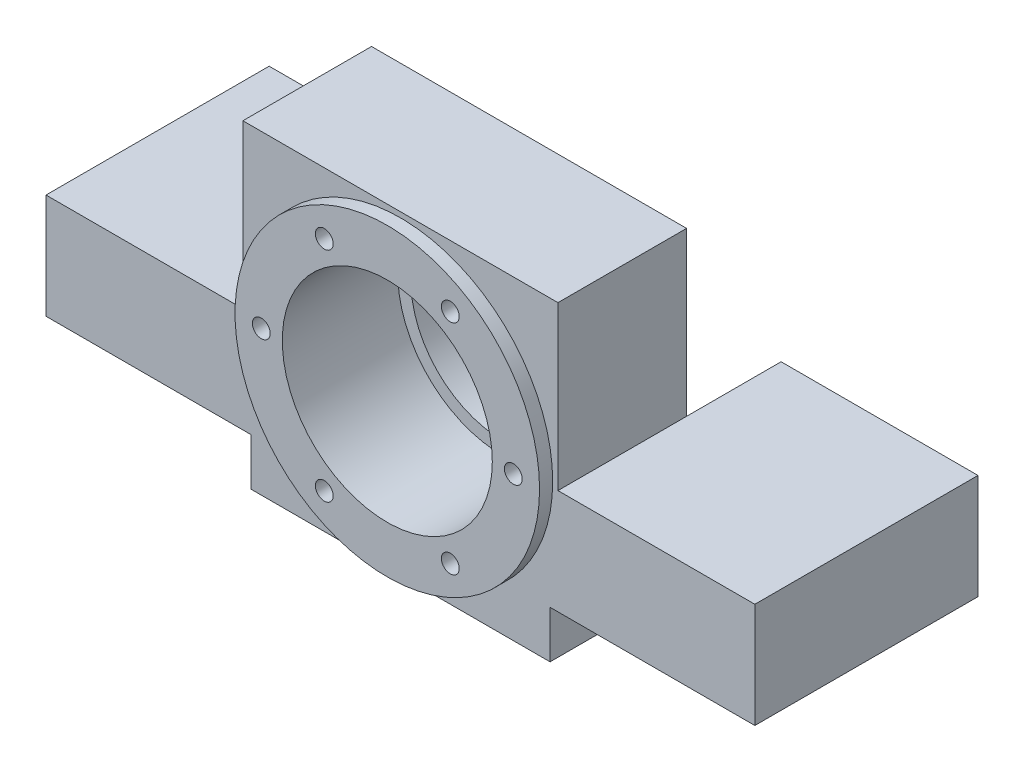
ISO-10303-21;
HEADER;
FILE_DESCRIPTION(('STEP AP214'),'2;1');
FILE_NAME('part.step','',(''),(''),'','','');
FILE_SCHEMA(('AUTOMOTIVE_DESIGN { 1 0 10303 214 1 1 1 1 }'));
ENDSEC;
DATA;
#1=APPLICATION_CONTEXT('core data for automotive mechanical design processes');
#2=APPLICATION_PROTOCOL_DEFINITION('international standard','automotive_design',2000,#1);
#3=PRODUCT_CONTEXT('',#1,'mechanical');
#4=PRODUCT('Part','Part','',(#3));
#5=PRODUCT_RELATED_PRODUCT_CATEGORY('part','',(#4));
#6=PRODUCT_DEFINITION_FORMATION('','',#4);
#7=PRODUCT_DEFINITION_CONTEXT('part definition',#1,'design');
#8=PRODUCT_DEFINITION('design','',#6,#7);
#9=PRODUCT_DEFINITION_SHAPE('','',#8);
#10=(LENGTH_UNIT() NAMED_UNIT(*) SI_UNIT(.MILLI.,.METRE.));
#11=(NAMED_UNIT(*) PLANE_ANGLE_UNIT() SI_UNIT($,.RADIAN.));
#12=(NAMED_UNIT(*) SI_UNIT($,.STERADIAN.) SOLID_ANGLE_UNIT());
#13=UNCERTAINTY_MEASURE_WITH_UNIT(LENGTH_MEASURE(1.E-05),#10,'distance_accuracy_value','');
#14=(GEOMETRIC_REPRESENTATION_CONTEXT(3) GLOBAL_UNCERTAINTY_ASSIGNED_CONTEXT((#13)) GLOBAL_UNIT_ASSIGNED_CONTEXT((#10,
#11,#12)) REPRESENTATION_CONTEXT('',''));
#15=CARTESIAN_POINT('',(0.,0.,0.));
#16=DIRECTION('',(0.,0.,1.));
#17=DIRECTION('',(1.,0.,0.));
#18=AXIS2_PLACEMENT_3D('',#15,#16,#17);
#19=CARTESIAN_POINT('',(0.,0.,-85.));
#20=DIRECTION('',(0.,0.,1.));
#21=DIRECTION('',(1.,0.,0.));
#22=AXIS2_PLACEMENT_3D('',#19,#20,#21);
#23=PLANE('',#22);
#24=DIRECTION('',(-1.,0.,0.));
#25=VECTOR('',#24,1.);
#26=CARTESIAN_POINT('',(-135.,58.,-85.));
#27=LINE('',#26,#25);
#28=CARTESIAN_POINT('',(-60.,58.,-85.));
#29=VERTEX_POINT('',#28);
#30=CARTESIAN_POINT('',(-135.,58.,-85.));
#31=VERTEX_POINT('',#30);
#32=EDGE_CURVE('E192',#29,#31,#27,.T.);
#33=ORIENTED_EDGE('',*,*,#32,.F.);
#34=DIRECTION('',(0.,1.,0.));
#35=VECTOR('',#34,1.);
#36=CARTESIAN_POINT('',(-60.,0.,-85.));
#37=LINE('',#36,#35);
#38=CARTESIAN_POINT('',(-60.,18.,-85.));
#39=VERTEX_POINT('',#38);
#40=EDGE_CURVE('E307',#39,#29,#37,.T.);
#41=ORIENTED_EDGE('',*,*,#40,.F.);
#42=DIRECTION('',(1.,0.,0.));
#43=VECTOR('',#42,1.);
#44=CARTESIAN_POINT('',(-57.,18.,-85.));
#45=LINE('',#44,#43);
#46=CARTESIAN_POINT('',(-135.,18.,-85.));
#47=VERTEX_POINT('',#46);
#48=EDGE_CURVE('E142',#47,#39,#45,.T.);
#49=ORIENTED_EDGE('',*,*,#48,.F.);
#50=DIRECTION('',(0.,-1.,0.));
#51=VECTOR('',#50,1.);
#52=CARTESIAN_POINT('',(-135.,58.,-85.));
#53=LINE('',#52,#51);
#54=EDGE_CURVE('E294',#31,#47,#53,.T.);
#55=ORIENTED_EDGE('',*,*,#54,.F.);
#56=EDGE_LOOP('',(#33,#41,#49,#55));
#57=FACE_BOUND('',#56,.T.);
#58=ADVANCED_FACE('F45',(#57),#23,.F.);
#59=CARTESIAN_POINT('',(60.,120.,-85.));
#60=DIRECTION('',(1.,0.,0.));
#61=DIRECTION('',(0.,1.,0.));
#62=AXIS2_PLACEMENT_3D('',#59,#60,#61);
#63=PLANE('',#62);
#64=DIRECTION('',(0.,1.,0.));
#65=VECTOR('',#64,1.);
#66=CARTESIAN_POINT('',(60.,0.,-49.));
#67=LINE('',#66,#65);
#68=CARTESIAN_POINT('',(60.,58.,-49.));
#69=VERTEX_POINT('',#68);
#70=CARTESIAN_POINT('',(60.,120.,-49.));
#71=VERTEX_POINT('',#70);
#72=EDGE_CURVE('E216',#69,#71,#67,.T.);
#73=ORIENTED_EDGE('',*,*,#72,.T.);
#74=DIRECTION('',(0.,0.,1.));
#75=VECTOR('',#74,1.);
#76=CARTESIAN_POINT('',(60.,120.,-85.));
#77=LINE('',#76,#75);
#78=CARTESIAN_POINT('',(60.,120.,0.));
#79=VERTEX_POINT('',#78);
#80=EDGE_CURVE('E154',#71,#79,#77,.T.);
#81=ORIENTED_EDGE('',*,*,#80,.T.);
#82=DIRECTION('',(0.,1.,0.));
#83=VECTOR('',#82,1.);
#84=CARTESIAN_POINT('',(60.,120.,0.));
#85=LINE('',#84,#83);
#86=CARTESIAN_POINT('',(60.,58.,0.));
#87=VERTEX_POINT('',#86);
#88=EDGE_CURVE('E158',#87,#79,#85,.T.);
#89=ORIENTED_EDGE('',*,*,#88,.F.);
#90=DIRECTION('',(0.,0.,1.));
#91=VECTOR('',#90,1.);
#92=CARTESIAN_POINT('',(60.,58.,-85.));
#93=LINE('',#92,#91);
#94=EDGE_CURVE('E112',#69,#87,#93,.T.);
#95=ORIENTED_EDGE('',*,*,#94,.F.);
#96=EDGE_LOOP('',(#73,#81,#89,#95));
#97=FACE_BOUND('',#96,.T.);
#98=ADVANCED_FACE('F47',(#97),#63,.T.);
#99=CARTESIAN_POINT('',(60.,58.,-85.));
#100=DIRECTION('',(0.,1.,0.));
#101=DIRECTION('',(-1.,0.,0.));
#102=AXIS2_PLACEMENT_3D('',#99,#100,#101);
#103=PLANE('',#102);
#104=DIRECTION('',(-1.,0.,0.));
#105=VECTOR('',#104,1.);
#106=CARTESIAN_POINT('',(60.,58.,0.));
#107=LINE('',#106,#105);
#108=CARTESIAN_POINT('',(135.,58.,0.));
#109=VERTEX_POINT('',#108);
#110=EDGE_CURVE('E189',#109,#87,#107,.T.);
#111=ORIENTED_EDGE('',*,*,#110,.F.);
#112=DIRECTION('',(0.,0.,1.));
#113=VECTOR('',#112,1.);
#114=CARTESIAN_POINT('',(135.,58.,-85.));
#115=LINE('',#114,#113);
#116=CARTESIAN_POINT('',(135.,58.,-85.));
#117=VERTEX_POINT('',#116);
#118=EDGE_CURVE('E105',#117,#109,#115,.T.);
#119=ORIENTED_EDGE('',*,*,#118,.F.);
#120=DIRECTION('',(-1.,0.,0.));
#121=VECTOR('',#120,1.);
#122=CARTESIAN_POINT('',(60.,58.,-85.));
#123=LINE('',#122,#121);
#124=CARTESIAN_POINT('',(60.,58.,-85.));
#125=VERTEX_POINT('',#124);
#126=EDGE_CURVE('E152',#117,#125,#123,.T.);
#127=ORIENTED_EDGE('',*,*,#126,.T.);
#128=EDGE_CURVE('E55',#125,#69,#93,.T.);
#129=ORIENTED_EDGE('',*,*,#128,.T.);
#130=ORIENTED_EDGE('',*,*,#94,.T.);
#131=EDGE_LOOP('',(#111,#119,#127,#129,#130));
#132=FACE_BOUND('',#131,.T.);
#133=ADVANCED_FACE('F224',(#132),#103,.T.);
#134=CARTESIAN_POINT('',(135.,58.,-85.));
#135=DIRECTION('',(1.,0.,0.));
#136=DIRECTION('',(0.,0.,-1.));
#137=AXIS2_PLACEMENT_3D('',#134,#135,#136);
#138=PLANE('',#137);
#139=DIRECTION('',(0.,1.,0.));
#140=VECTOR('',#139,1.);
#141=CARTESIAN_POINT('',(135.,58.,0.));
#142=LINE('',#141,#140);
#143=CARTESIAN_POINT('',(135.,18.,0.));
#144=VERTEX_POINT('',#143);
#145=EDGE_CURVE('E146',#144,#109,#142,.T.);
#146=ORIENTED_EDGE('',*,*,#145,.F.);
#147=DIRECTION('',(0.,0.,1.));
#148=VECTOR('',#147,1.);
#149=CARTESIAN_POINT('',(135.,18.,-85.));
#150=LINE('',#149,#148);
#151=CARTESIAN_POINT('',(135.,18.,-85.));
#152=VERTEX_POINT('',#151);
#153=EDGE_CURVE('E134',#152,#144,#150,.T.);
#154=ORIENTED_EDGE('',*,*,#153,.F.);
#155=DIRECTION('',(0.,1.,0.));
#156=VECTOR('',#155,1.);
#157=CARTESIAN_POINT('',(135.,58.,-85.));
#158=LINE('',#157,#156);
#159=EDGE_CURVE('E141',#152,#117,#158,.T.);
#160=ORIENTED_EDGE('',*,*,#159,.T.);
#161=ORIENTED_EDGE('',*,*,#118,.T.);
#162=EDGE_LOOP('',(#146,#154,#160,#161));
#163=FACE_BOUND('',#162,.T.);
#164=ADVANCED_FACE('F144',(#163),#138,.T.);
#165=CARTESIAN_POINT('',(57.,18.,-85.));
#166=DIRECTION('',(0.,-1.,0.));
#167=DIRECTION('',(0.,0.,-1.));
#168=AXIS2_PLACEMENT_3D('',#165,#166,#167);
#169=PLANE('',#168);
#170=DIRECTION('',(0.,0.,1.));
#171=VECTOR('',#170,1.);
#172=CARTESIAN_POINT('',(60.,18.,-85.));
#173=LINE('',#172,#171);
#174=CARTESIAN_POINT('',(60.,18.,-85.));
#175=VERTEX_POINT('',#174);
#176=CARTESIAN_POINT('',(60.,18.,-49.));
#177=VERTEX_POINT('',#176);
#178=EDGE_CURVE('E138',#175,#177,#173,.T.);
#179=ORIENTED_EDGE('',*,*,#178,.F.);
#180=DIRECTION('',(1.,0.,0.));
#181=VECTOR('',#180,1.);
#182=CARTESIAN_POINT('',(57.,18.,-85.));
#183=LINE('',#182,#181);
#184=EDGE_CURVE('E130',#175,#152,#183,.T.);
#185=ORIENTED_EDGE('',*,*,#184,.T.);
#186=ORIENTED_EDGE('',*,*,#153,.T.);
#187=DIRECTION('',(1.,0.,0.));
#188=VECTOR('',#187,1.);
#189=CARTESIAN_POINT('',(57.,18.,0.));
#190=LINE('',#189,#188);
#191=CARTESIAN_POINT('',(57.,18.,0.));
#192=VERTEX_POINT('',#191);
#193=EDGE_CURVE('E186',#192,#144,#190,.T.);
#194=ORIENTED_EDGE('',*,*,#193,.F.);
#195=DIRECTION('',(0.,0.,1.));
#196=VECTOR('',#195,1.);
#197=CARTESIAN_POINT('',(57.,18.,-85.));
#198=LINE('',#197,#196);
#199=CARTESIAN_POINT('',(57.,18.,-49.));
#200=VERTEX_POINT('',#199);
#201=EDGE_CURVE('E148',#200,#192,#198,.T.);
#202=ORIENTED_EDGE('',*,*,#201,.F.);
#203=DIRECTION('',(-1.,0.,0.));
#204=VECTOR('',#203,1.);
#205=CARTESIAN_POINT('',(57.,18.,-49.));
#206=LINE('',#205,#204);
#207=EDGE_CURVE('E348',#177,#200,#206,.T.);
#208=ORIENTED_EDGE('',*,*,#207,.F.);
#209=EDGE_LOOP('',(#179,#185,#186,#194,#202,#208));
#210=FACE_BOUND('',#209,.T.);
#211=ADVANCED_FACE('F132',(#210),#169,.T.);
#212=CARTESIAN_POINT('',(57.,0.,-85.));
#213=DIRECTION('',(1.,0.,0.));
#214=DIRECTION('',(0.,0.,-1.));
#215=AXIS2_PLACEMENT_3D('',#212,#213,#214);
#216=PLANE('',#215);
#217=DIRECTION('',(0.,-1.,0.));
#218=VECTOR('',#217,1.);
#219=CARTESIAN_POINT('',(57.,0.,-49.));
#220=LINE('',#219,#218);
#221=CARTESIAN_POINT('',(57.,0.,-49.));
#222=VERTEX_POINT('',#221);
#223=EDGE_CURVE('E345',#200,#222,#220,.T.);
#224=ORIENTED_EDGE('',*,*,#223,.F.);
#225=ORIENTED_EDGE('',*,*,#201,.T.);
#226=DIRECTION('',(0.,1.,0.));
#227=VECTOR('',#226,1.);
#228=CARTESIAN_POINT('',(57.,0.,0.));
#229=LINE('',#228,#227);
#230=CARTESIAN_POINT('',(57.,0.,0.));
#231=VERTEX_POINT('',#230);
#232=EDGE_CURVE('E183',#231,#192,#229,.T.);
#233=ORIENTED_EDGE('',*,*,#232,.F.);
#234=DIRECTION('',(0.,0.,1.));
#235=VECTOR('',#234,1.);
#236=CARTESIAN_POINT('',(57.,0.,-85.));
#237=LINE('',#236,#235);
#238=EDGE_CURVE('E196',#222,#231,#237,.T.);
#239=ORIENTED_EDGE('',*,*,#238,.F.);
#240=EDGE_LOOP('',(#224,#225,#233,#239));
#241=FACE_BOUND('',#240,.T.);
#242=ADVANCED_FACE('F543',(#241),#216,.T.);
#243=CARTESIAN_POINT('',(0.,0.,-85.));
#244=DIRECTION('',(0.,-1.,0.));
#245=DIRECTION('',(0.,0.,-1.));
#246=AXIS2_PLACEMENT_3D('',#243,#244,#245);
#247=PLANE('',#246);
#248=DIRECTION('',(1.,0.,0.));
#249=VECTOR('',#248,1.);
#250=CARTESIAN_POINT('',(-60.,0.,-49.));
#251=LINE('',#250,#249);
#252=CARTESIAN_POINT('',(-57.,0.,-49.));
#253=VERTEX_POINT('',#252);
#254=EDGE_CURVE('E335',#253,#222,#251,.T.);
#255=ORIENTED_EDGE('',*,*,#254,.T.);
#256=ORIENTED_EDGE('',*,*,#238,.T.);
#257=DIRECTION('',(1.,0.,0.));
#258=VECTOR('',#257,1.);
#259=CARTESIAN_POINT('',(0.,0.,0.));
#260=LINE('',#259,#258);
#261=CARTESIAN_POINT('',(-57.,0.,0.));
#262=VERTEX_POINT('',#261);
#263=EDGE_CURVE('E180',#262,#231,#260,.T.);
#264=ORIENTED_EDGE('',*,*,#263,.F.);
#265=DIRECTION('',(0.,0.,1.));
#266=VECTOR('',#265,1.);
#267=CARTESIAN_POINT('',(-57.,0.,-85.));
#268=LINE('',#267,#266);
#269=EDGE_CURVE('E198',#253,#262,#268,.T.);
#270=ORIENTED_EDGE('',*,*,#269,.F.);
#271=EDGE_LOOP('',(#255,#256,#264,#270));
#272=FACE_BOUND('',#271,.T.);
#273=ADVANCED_FACE('F534',(#272),#247,.T.);
#274=CARTESIAN_POINT('',(-57.,0.,-85.));
#275=DIRECTION('',(-1.,0.,0.));
#276=DIRECTION('',(0.,0.,1.));
#277=AXIS2_PLACEMENT_3D('',#274,#275,#276);
#278=PLANE('',#277);
#279=DIRECTION('',(0.,1.,0.));
#280=VECTOR('',#279,1.);
#281=CARTESIAN_POINT('',(-57.,0.,-49.));
#282=LINE('',#281,#280);
#283=CARTESIAN_POINT('',(-57.,18.,-49.));
#284=VERTEX_POINT('',#283);
#285=EDGE_CURVE('E343',#253,#284,#282,.T.);
#286=ORIENTED_EDGE('',*,*,#285,.F.);
#287=ORIENTED_EDGE('',*,*,#269,.T.);
#288=DIRECTION('',(0.,-1.,0.));
#289=VECTOR('',#288,1.);
#290=CARTESIAN_POINT('',(-57.,0.,0.));
#291=LINE('',#290,#289);
#292=CARTESIAN_POINT('',(-57.,18.,0.));
#293=VERTEX_POINT('',#292);
#294=EDGE_CURVE('E177',#293,#262,#291,.T.);
#295=ORIENTED_EDGE('',*,*,#294,.F.);
#296=DIRECTION('',(0.,0.,1.));
#297=VECTOR('',#296,1.);
#298=CARTESIAN_POINT('',(-57.,18.,-85.));
#299=LINE('',#298,#297);
#300=EDGE_CURVE('E200',#284,#293,#299,.T.);
#301=ORIENTED_EDGE('',*,*,#300,.F.);
#302=EDGE_LOOP('',(#286,#287,#295,#301));
#303=FACE_BOUND('',#302,.T.);
#304=ADVANCED_FACE('F526',(#303),#278,.T.);
#305=CARTESIAN_POINT('',(-57.,18.,-85.));
#306=DIRECTION('',(0.,-1.,0.));
#307=DIRECTION('',(1.,0.,0.));
#308=AXIS2_PLACEMENT_3D('',#305,#306,#307);
#309=PLANE('',#308);
#310=DIRECTION('',(0.,0.,-1.));
#311=VECTOR('',#310,1.);
#312=CARTESIAN_POINT('',(-60.,18.,-85.));
#313=LINE('',#312,#311);
#314=CARTESIAN_POINT('',(-60.,18.,-49.));
#315=VERTEX_POINT('',#314);
#316=EDGE_CURVE('E302',#315,#39,#313,.T.);
#317=ORIENTED_EDGE('',*,*,#316,.F.);
#318=DIRECTION('',(-1.,0.,0.));
#319=VECTOR('',#318,1.);
#320=CARTESIAN_POINT('',(-57.,18.,-49.));
#321=LINE('',#320,#319);
#322=EDGE_CURVE('E331',#284,#315,#321,.T.);
#323=ORIENTED_EDGE('',*,*,#322,.F.);
#324=ORIENTED_EDGE('',*,*,#300,.T.);
#325=DIRECTION('',(1.,0.,0.));
#326=VECTOR('',#325,1.);
#327=CARTESIAN_POINT('',(-57.,18.,0.));
#328=LINE('',#327,#326);
#329=CARTESIAN_POINT('',(-135.,18.,0.));
#330=VERTEX_POINT('',#329);
#331=EDGE_CURVE('E174',#330,#293,#328,.T.);
#332=ORIENTED_EDGE('',*,*,#331,.F.);
#333=DIRECTION('',(0.,0.,1.));
#334=VECTOR('',#333,1.);
#335=CARTESIAN_POINT('',(-135.,18.,-85.));
#336=LINE('',#335,#334);
#337=EDGE_CURVE('E202',#47,#330,#336,.T.);
#338=ORIENTED_EDGE('',*,*,#337,.F.);
#339=ORIENTED_EDGE('',*,*,#48,.T.);
#340=EDGE_LOOP('',(#317,#323,#324,#332,#338,#339));
#341=FACE_BOUND('',#340,.T.);
#342=ADVANCED_FACE('F299',(#341),#309,.T.);
#343=CARTESIAN_POINT('',(-135.,58.,-85.));
#344=DIRECTION('',(-1.,0.,0.));
#345=DIRECTION('',(0.,0.,1.));
#346=AXIS2_PLACEMENT_3D('',#343,#344,#345);
#347=PLANE('',#346);
#348=DIRECTION('',(0.,-1.,0.));
#349=VECTOR('',#348,1.);
#350=CARTESIAN_POINT('',(-135.,58.,0.));
#351=LINE('',#350,#349);
#352=CARTESIAN_POINT('',(-135.,58.,0.));
#353=VERTEX_POINT('',#352);
#354=EDGE_CURVE('E171',#353,#330,#351,.T.);
#355=ORIENTED_EDGE('',*,*,#354,.F.);
#356=DIRECTION('',(0.,0.,1.));
#357=VECTOR('',#356,1.);
#358=CARTESIAN_POINT('',(-135.,58.,-85.));
#359=LINE('',#358,#357);
#360=EDGE_CURVE('E120',#31,#353,#359,.T.);
#361=ORIENTED_EDGE('',*,*,#360,.F.);
#362=ORIENTED_EDGE('',*,*,#54,.T.);
#363=ORIENTED_EDGE('',*,*,#337,.T.);
#364=EDGE_LOOP('',(#355,#361,#362,#363));
#365=FACE_BOUND('',#364,.T.);
#366=ADVANCED_FACE('F308',(#365),#347,.T.);
#367=CARTESIAN_POINT('',(-135.,58.,-85.));
#368=DIRECTION('',(0.,1.,0.));
#369=DIRECTION('',(-1.,0.,0.));
#370=AXIS2_PLACEMENT_3D('',#367,#368,#369);
#371=PLANE('',#370);
#372=DIRECTION('',(-1.,0.,0.));
#373=VECTOR('',#372,1.);
#374=CARTESIAN_POINT('',(-135.,58.,0.));
#375=LINE('',#374,#373);
#376=CARTESIAN_POINT('',(-60.,58.,0.));
#377=VERTEX_POINT('',#376);
#378=EDGE_CURVE('E168',#377,#353,#375,.T.);
#379=ORIENTED_EDGE('',*,*,#378,.F.);
#380=DIRECTION('',(0.,0.,1.));
#381=VECTOR('',#380,1.);
#382=CARTESIAN_POINT('',(-60.,58.,-85.));
#383=LINE('',#382,#381);
#384=CARTESIAN_POINT('',(-60.,58.,-49.));
#385=VERTEX_POINT('',#384);
#386=EDGE_CURVE('E208',#385,#377,#383,.T.);
#387=ORIENTED_EDGE('',*,*,#386,.F.);
#388=EDGE_CURVE('E205',#29,#385,#383,.T.);
#389=ORIENTED_EDGE('',*,*,#388,.F.);
#390=ORIENTED_EDGE('',*,*,#32,.T.);
#391=ORIENTED_EDGE('',*,*,#360,.T.);
#392=EDGE_LOOP('',(#379,#387,#389,#390,#391));
#393=FACE_BOUND('',#392,.T.);
#394=ADVANCED_FACE('F314',(#393),#371,.T.);
#395=CARTESIAN_POINT('',(-60.,58.,-85.));
#396=DIRECTION('',(-1.,0.,0.));
#397=DIRECTION('',(0.,0.,1.));
#398=AXIS2_PLACEMENT_3D('',#395,#396,#397);
#399=PLANE('',#398);
#400=DIRECTION('',(0.,1.,0.));
#401=VECTOR('',#400,1.);
#402=CARTESIAN_POINT('',(-60.,0.,-49.));
#403=LINE('',#402,#401);
#404=CARTESIAN_POINT('',(-60.,120.,-49.));
#405=VERTEX_POINT('',#404);
#406=EDGE_CURVE('E330',#385,#405,#403,.T.);
#407=ORIENTED_EDGE('',*,*,#406,.F.);
#408=ORIENTED_EDGE('',*,*,#386,.T.);
#409=DIRECTION('',(0.,-1.,0.));
#410=VECTOR('',#409,1.);
#411=CARTESIAN_POINT('',(-60.,58.,0.));
#412=LINE('',#411,#410);
#413=CARTESIAN_POINT('',(-60.,120.,0.));
#414=VERTEX_POINT('',#413);
#415=EDGE_CURVE('E165',#414,#377,#412,.T.);
#416=ORIENTED_EDGE('',*,*,#415,.F.);
#417=DIRECTION('',(0.,0.,1.));
#418=VECTOR('',#417,1.);
#419=CARTESIAN_POINT('',(-60.,120.,-85.));
#420=LINE('',#419,#418);
#421=EDGE_CURVE('E209',#405,#414,#420,.T.);
#422=ORIENTED_EDGE('',*,*,#421,.F.);
#423=EDGE_LOOP('',(#407,#408,#416,#422));
#424=FACE_BOUND('',#423,.T.);
#425=ADVANCED_FACE('F334',(#424),#399,.T.);
#426=CARTESIAN_POINT('',(-60.,120.,-85.));
#427=DIRECTION('',(0.,1.,0.));
#428=DIRECTION('',(0.,0.,1.));
#429=AXIS2_PLACEMENT_3D('',#426,#427,#428);
#430=PLANE('',#429);
#431=DIRECTION('',(1.,0.,0.));
#432=VECTOR('',#431,1.);
#433=CARTESIAN_POINT('',(-60.,120.,-49.));
#434=LINE('',#433,#432);
#435=EDGE_CURVE('E337',#405,#71,#434,.T.);
#436=ORIENTED_EDGE('',*,*,#435,.F.);
#437=ORIENTED_EDGE('',*,*,#421,.T.);
#438=DIRECTION('',(-1.,0.,0.));
#439=VECTOR('',#438,1.);
#440=CARTESIAN_POINT('',(-60.,120.,0.));
#441=LINE('',#440,#439);
#442=EDGE_CURVE('E161',#79,#414,#441,.T.);
#443=ORIENTED_EDGE('',*,*,#442,.F.);
#444=ORIENTED_EDGE('',*,*,#80,.F.);
#445=EDGE_LOOP('',(#436,#437,#443,#444));
#446=FACE_BOUND('',#445,.T.);
#447=ADVANCED_FACE('F219',(#446),#430,.T.);
#448=ORIENTED_EDGE('',*,*,#184,.F.);
#449=DIRECTION('',(0.,1.,0.));
#450=VECTOR('',#449,1.);
#451=CARTESIAN_POINT('',(60.,0.,-85.));
#452=LINE('',#451,#450);
#453=EDGE_CURVE('E744',#175,#125,#452,.T.);
#454=ORIENTED_EDGE('',*,*,#453,.T.);
#455=ORIENTED_EDGE('',*,*,#126,.F.);
#456=ORIENTED_EDGE('',*,*,#159,.F.);
#457=EDGE_LOOP('',(#448,#454,#455,#456));
#458=FACE_BOUND('',#457,.T.);
#459=ADVANCED_FACE('F150',(#458),#23,.F.);
#460=CARTESIAN_POINT('',(0.,0.,0.));
#461=DIRECTION('',(0.,0.,1.));
#462=DIRECTION('',(1.,0.,0.));
#463=AXIS2_PLACEMENT_3D('',#460,#461,#462);
#464=PLANE('',#463);
#465=CARTESIAN_POINT('',(0.,60.,0.));
#466=DIRECTION('',(0.,0.,1.));
#467=DIRECTION('',(1.,0.,0.));
#468=AXIS2_PLACEMENT_3D('',#465,#466,#467);
#469=CIRCLE('',#468,58.);
#470=CARTESIAN_POINT('',(58.,60.,0.));
#471=VERTEX_POINT('',#470);
#472=EDGE_CURVE('E11',#471,#471,#469,.T.);
#473=ORIENTED_EDGE('',*,*,#472,.F.);
#474=EDGE_LOOP('',(#473));
#475=FACE_BOUND('',#474,.T.);
#476=ORIENTED_EDGE('',*,*,#88,.T.);
#477=ORIENTED_EDGE('',*,*,#442,.T.);
#478=ORIENTED_EDGE('',*,*,#415,.T.);
#479=ORIENTED_EDGE('',*,*,#378,.T.);
#480=ORIENTED_EDGE('',*,*,#354,.T.);
#481=ORIENTED_EDGE('',*,*,#331,.T.);
#482=ORIENTED_EDGE('',*,*,#294,.T.);
#483=ORIENTED_EDGE('',*,*,#263,.T.);
#484=ORIENTED_EDGE('',*,*,#232,.T.);
#485=ORIENTED_EDGE('',*,*,#193,.T.);
#486=ORIENTED_EDGE('',*,*,#145,.T.);
#487=ORIENTED_EDGE('',*,*,#110,.T.);
#488=EDGE_LOOP('',(#476,#477,#478,#479,#480,#481,#482,#483,#484,#485,#486,#487));
#489=FACE_BOUND('',#488,.T.);
#490=ADVANCED_FACE('F223',(#475,#489),#464,.T.);
#491=CARTESIAN_POINT('',(0.,60.,5.));
#492=DIRECTION('',(0.,0.,-1.));
#493=DIRECTION('',(-1.,0.,0.));
#494=AXIS2_PLACEMENT_3D('',#491,#492,#493);
#495=CYLINDRICAL_SURFACE('',#494,58.);
#496=CARTESIAN_POINT('',(0.,60.,5.));
#497=DIRECTION('',(0.,0.,1.));
#498=DIRECTION('',(1.,0.,0.));
#499=AXIS2_PLACEMENT_3D('',#496,#497,#498);
#500=CIRCLE('',#499,58.);
#501=CARTESIAN_POINT('',(58.,60.,5.));
#502=VERTEX_POINT('',#501);
#503=EDGE_CURVE('E162',#502,#502,#500,.T.);
#504=ORIENTED_EDGE('',*,*,#503,.F.);
#505=EDGE_LOOP('',(#504));
#506=FACE_BOUND('',#505,.T.);
#507=ORIENTED_EDGE('',*,*,#472,.T.);
#508=EDGE_LOOP('',(#507));
#509=FACE_BOUND('',#508,.T.);
#510=ADVANCED_FACE('F394',(#506,#509),#495,.T.);
#511=CARTESIAN_POINT('',(0.,60.,5.));
#512=DIRECTION('',(0.,0.,1.));
#513=DIRECTION('',(1.,0.,0.));
#514=AXIS2_PLACEMENT_3D('',#511,#512,#513);
#515=PLANE('',#514);
#516=CARTESIAN_POINT('',(48.,60.0000000000006,5.));
#517=DIRECTION('',(0.,0.,1.));
#518=DIRECTION('',(1.,0.,0.));
#519=AXIS2_PLACEMENT_3D('',#516,#517,#518);
#520=CIRCLE('',#519,3.39999999999999);
#521=CARTESIAN_POINT('',(51.4,60.0000000000006,5.));
#522=VERTEX_POINT('',#521);
#523=EDGE_CURVE('E352',#522,#522,#520,.T.);
#524=ORIENTED_EDGE('',*,*,#523,.F.);
#525=EDGE_LOOP('',(#524));
#526=FACE_BOUND('',#525,.T.);
#527=CARTESIAN_POINT('',(24.0000000000004,18.4307806183472,5.));
#528=DIRECTION('',(0.,0.,1.));
#529=DIRECTION('',(1.,0.,0.));
#530=AXIS2_PLACEMENT_3D('',#527,#528,#529);
#531=CIRCLE('',#530,3.39999999999999);
#532=CARTESIAN_POINT('',(27.4000000000004,18.4307806183472,5.));
#533=VERTEX_POINT('',#532);
#534=EDGE_CURVE('E358',#533,#533,#531,.T.);
#535=ORIENTED_EDGE('',*,*,#534,.F.);
#536=EDGE_LOOP('',(#535));
#537=FACE_BOUND('',#536,.T.);
#538=CARTESIAN_POINT('',(-24.,18.4307806183469,5.));
#539=DIRECTION('',(0.,0.,1.));
#540=DIRECTION('',(1.,0.,0.));
#541=AXIS2_PLACEMENT_3D('',#538,#539,#540);
#542=CIRCLE('',#541,3.39999999999999);
#543=CARTESIAN_POINT('',(-20.6,18.4307806183469,5.));
#544=VERTEX_POINT('',#543);
#545=EDGE_CURVE('E364',#544,#544,#542,.T.);
#546=ORIENTED_EDGE('',*,*,#545,.F.);
#547=EDGE_LOOP('',(#546));
#548=FACE_BOUND('',#547,.T.);
#549=CARTESIAN_POINT('',(-48.,59.9999999999998,5.));
#550=DIRECTION('',(0.,0.,1.));
#551=DIRECTION('',(1.,0.,0.));
#552=AXIS2_PLACEMENT_3D('',#549,#550,#551);
#553=CIRCLE('',#552,3.39999999999999);
#554=CARTESIAN_POINT('',(-44.6,59.9999999999998,5.));
#555=VERTEX_POINT('',#554);
#556=EDGE_CURVE('E370',#555,#555,#553,.T.);
#557=ORIENTED_EDGE('',*,*,#556,.F.);
#558=EDGE_LOOP('',(#557));
#559=FACE_BOUND('',#558,.T.);
#560=CARTESIAN_POINT('',(-24.0000000000001,101.569219381653,5.));
#561=DIRECTION('',(0.,0.,1.));
#562=DIRECTION('',(1.,0.,0.));
#563=AXIS2_PLACEMENT_3D('',#560,#561,#562);
#564=CIRCLE('',#563,3.39999999999999);
#565=CARTESIAN_POINT('',(-20.6000000000001,101.569219381653,5.));
#566=VERTEX_POINT('',#565);
#567=EDGE_CURVE('E376',#566,#566,#564,.T.);
#568=ORIENTED_EDGE('',*,*,#567,.F.);
#569=EDGE_LOOP('',(#568));
#570=FACE_BOUND('',#569,.T.);
#571=CARTESIAN_POINT('',(24.,101.569219381653,5.));
#572=DIRECTION('',(0.,0.,1.));
#573=DIRECTION('',(1.,0.,0.));
#574=AXIS2_PLACEMENT_3D('',#571,#572,#573);
#575=CIRCLE('',#574,3.39999999999999);
#576=CARTESIAN_POINT('',(27.4,101.569219381653,5.));
#577=VERTEX_POINT('',#576);
#578=EDGE_CURVE('E275',#577,#577,#575,.T.);
#579=ORIENTED_EDGE('',*,*,#578,.F.);
#580=EDGE_LOOP('',(#579));
#581=FACE_BOUND('',#580,.T.);
#582=CARTESIAN_POINT('',(0.,60.,5.));
#583=DIRECTION('',(0.,0.,1.));
#584=DIRECTION('',(1.,0.,0.));
#585=AXIS2_PLACEMENT_3D('',#582,#583,#584);
#586=CIRCLE('',#585,40.);
#587=CARTESIAN_POINT('',(40.,60.,5.));
#588=VERTEX_POINT('',#587);
#589=EDGE_CURVE('E278',#588,#588,#586,.T.);
#590=ORIENTED_EDGE('',*,*,#589,.F.);
#591=EDGE_LOOP('',(#590));
#592=FACE_BOUND('',#591,.T.);
#593=ORIENTED_EDGE('',*,*,#503,.T.);
#594=EDGE_LOOP('',(#593));
#595=FACE_BOUND('',#594,.T.);
#596=ADVANCED_FACE('F390',(#526,#537,#548,#559,#570,#581,#592,#595),#515,.T.);
#597=CARTESIAN_POINT('',(0.,60.,-39.));
#598=DIRECTION('',(0.,0.,1.));
#599=DIRECTION('',(1.,0.,0.));
#600=AXIS2_PLACEMENT_3D('',#597,#598,#599);
#601=CYLINDRICAL_SURFACE('',#600,40.);
#602=CARTESIAN_POINT('',(0.,60.,-39.));
#603=DIRECTION('',(0.,0.,1.));
#604=DIRECTION('',(1.,0.,0.));
#605=AXIS2_PLACEMENT_3D('',#602,#603,#604);
#606=CIRCLE('',#605,40.);
#607=CARTESIAN_POINT('',(40.,60.,-39.));
#608=VERTEX_POINT('',#607);
#609=EDGE_CURVE('E285',#608,#608,#606,.T.);
#610=ORIENTED_EDGE('',*,*,#609,.F.);
#611=EDGE_LOOP('',(#610));
#612=FACE_BOUND('',#611,.T.);
#613=ORIENTED_EDGE('',*,*,#589,.T.);
#614=EDGE_LOOP('',(#613));
#615=FACE_BOUND('',#614,.T.);
#616=ADVANCED_FACE('F393',(#612,#615),#601,.F.);
#617=CARTESIAN_POINT('',(0.,60.,-39.));
#618=DIRECTION('',(0.,0.,1.));
#619=DIRECTION('',(1.,0.,0.));
#620=AXIS2_PLACEMENT_3D('',#617,#618,#619);
#621=PLANE('',#620);
#622=CARTESIAN_POINT('',(0.,60.,-39.));
#623=DIRECTION('',(0.,0.,1.));
#624=DIRECTION('',(1.,0.,0.));
#625=AXIS2_PLACEMENT_3D('',#622,#623,#624);
#626=CIRCLE('',#625,35.);
#627=CARTESIAN_POINT('',(35.,60.,-39.));
#628=VERTEX_POINT('',#627);
#629=EDGE_CURVE('E274',#628,#628,#626,.T.);
#630=ORIENTED_EDGE('',*,*,#629,.F.);
#631=EDGE_LOOP('',(#630));
#632=FACE_BOUND('',#631,.T.);
#633=ORIENTED_EDGE('',*,*,#609,.T.);
#634=EDGE_LOOP('',(#633));
#635=FACE_BOUND('',#634,.T.);
#636=ADVANCED_FACE('F424',(#632,#635),#621,.T.);
#637=CARTESIAN_POINT('',(0.,60.,-85.));
#638=DIRECTION('',(0.,0.,1.));
#639=DIRECTION('',(1.,0.,0.));
#640=AXIS2_PLACEMENT_3D('',#637,#638,#639);
#641=CYLINDRICAL_SURFACE('',#640,35.);
#642=CARTESIAN_POINT('',(0.,60.,-49.));
#643=DIRECTION('',(0.,0.,1.));
#644=DIRECTION('',(1.,0.,0.));
#645=AXIS2_PLACEMENT_3D('',#642,#643,#644);
#646=CIRCLE('',#645,35.);
#647=CARTESIAN_POINT('',(35.,60.,-49.));
#648=VERTEX_POINT('',#647);
#649=EDGE_CURVE('E49',#648,#648,#646,.F.);
#650=ORIENTED_EDGE('',*,*,#649,.T.);
#651=EDGE_LOOP('',(#650));
#652=FACE_BOUND('',#651,.T.);
#653=ORIENTED_EDGE('',*,*,#629,.T.);
#654=EDGE_LOOP('',(#653));
#655=FACE_BOUND('',#654,.T.);
#656=ADVANCED_FACE('F268',(#652,#655),#641,.F.);
#657=CARTESIAN_POINT('',(24.,101.569219381653,-22.76));
#658=DIRECTION('',(0.,0.,1.));
#659=DIRECTION('',(1.,0.,0.));
#660=AXIS2_PLACEMENT_3D('',#657,#658,#659);
#661=CONICAL_SURFACE('',#660,3.39999999999999,1.02974425867665);
#662=CARTESIAN_POINT('',(24.,101.569219381653,-24.8029261046937));
#663=VERTEX_POINT('',#662);
#664=VERTEX_LOOP('',#663);
#665=FACE_BOUND('',#664,.T.);
#666=CARTESIAN_POINT('',(24.,101.569219381653,-22.76));
#667=DIRECTION('',(0.,0.,1.));
#668=DIRECTION('',(1.,0.,0.));
#669=AXIS2_PLACEMENT_3D('',#666,#667,#668);
#670=CIRCLE('',#669,3.39999999999999);
#671=CARTESIAN_POINT('',(27.4,101.569219381653,-22.76));
#672=VERTEX_POINT('',#671);
#673=EDGE_CURVE('E272',#672,#672,#670,.T.);
#674=ORIENTED_EDGE('',*,*,#673,.T.);
#675=EDGE_LOOP('',(#674));
#676=FACE_BOUND('',#675,.T.);
#677=ADVANCED_FACE('F264',(#665,#676),#661,.F.);
#678=CARTESIAN_POINT('',(24.,101.569219381653,5.));
#679=DIRECTION('',(0.,0.,1.));
#680=DIRECTION('',(1.,0.,0.));
#681=AXIS2_PLACEMENT_3D('',#678,#679,#680);
#682=CYLINDRICAL_SURFACE('',#681,3.39999999999999);
#683=ORIENTED_EDGE('',*,*,#673,.F.);
#684=EDGE_LOOP('',(#683));
#685=FACE_BOUND('',#684,.T.);
#686=ORIENTED_EDGE('',*,*,#578,.T.);
#687=EDGE_LOOP('',(#686));
#688=FACE_BOUND('',#687,.T.);
#689=ADVANCED_FACE('F267',(#685,#688),#682,.F.);
#690=CARTESIAN_POINT('',(-24.0000000000001,101.569219381653,-22.76));
#691=DIRECTION('',(0.,0.,1.));
#692=DIRECTION('',(1.,0.,0.));
#693=AXIS2_PLACEMENT_3D('',#690,#691,#692);
#694=CONICAL_SURFACE('',#693,3.39999999999999,1.02974425867665);
#695=CARTESIAN_POINT('',(-24.0000000000001,101.569219381653,-24.8029261046937));
#696=VERTEX_POINT('',#695);
#697=VERTEX_LOOP('',#696);
#698=FACE_BOUND('',#697,.T.);
#699=CARTESIAN_POINT('',(-24.0000000000001,101.569219381653,-22.76));
#700=DIRECTION('',(0.,0.,1.));
#701=DIRECTION('',(1.,0.,0.));
#702=AXIS2_PLACEMENT_3D('',#699,#700,#701);
#703=CIRCLE('',#702,3.39999999999999);
#704=CARTESIAN_POINT('',(-20.6000000000001,101.569219381653,-22.76));
#705=VERTEX_POINT('',#704);
#706=EDGE_CURVE('E281',#705,#705,#703,.T.);
#707=ORIENTED_EDGE('',*,*,#706,.T.);
#708=EDGE_LOOP('',(#707));
#709=FACE_BOUND('',#708,.T.);
#710=ADVANCED_FACE('F381',(#698,#709),#694,.F.);
#711=CARTESIAN_POINT('',(-24.0000000000001,101.569219381653,5.));
#712=DIRECTION('',(0.,0.,1.));
#713=DIRECTION('',(1.,0.,0.));
#714=AXIS2_PLACEMENT_3D('',#711,#712,#713);
#715=CYLINDRICAL_SURFACE('',#714,3.39999999999999);
#716=ORIENTED_EDGE('',*,*,#706,.F.);
#717=EDGE_LOOP('',(#716));
#718=FACE_BOUND('',#717,.T.);
#719=ORIENTED_EDGE('',*,*,#567,.T.);
#720=EDGE_LOOP('',(#719));
#721=FACE_BOUND('',#720,.T.);
#722=ADVANCED_FACE('F383',(#718,#721),#715,.F.);
#723=CARTESIAN_POINT('',(-48.,59.9999999999998,-22.76));
#724=DIRECTION('',(0.,0.,1.));
#725=DIRECTION('',(1.,0.,0.));
#726=AXIS2_PLACEMENT_3D('',#723,#724,#725);
#727=CONICAL_SURFACE('',#726,3.39999999999999,1.02974425867665);
#728=CARTESIAN_POINT('',(-48.,59.9999999999998,-24.8029261046937));
#729=VERTEX_POINT('',#728);
#730=VERTEX_LOOP('',#729);
#731=FACE_BOUND('',#730,.T.);
#732=CARTESIAN_POINT('',(-48.,59.9999999999998,-22.76));
#733=DIRECTION('',(0.,0.,1.));
#734=DIRECTION('',(1.,0.,0.));
#735=AXIS2_PLACEMENT_3D('',#732,#733,#734);
#736=CIRCLE('',#735,3.39999999999999);
#737=CARTESIAN_POINT('',(-44.6,59.9999999999998,-22.76));
#738=VERTEX_POINT('',#737);
#739=EDGE_CURVE('E373',#738,#738,#736,.T.);
#740=ORIENTED_EDGE('',*,*,#739,.T.);
#741=EDGE_LOOP('',(#740));
#742=FACE_BOUND('',#741,.T.);
#743=ADVANCED_FACE('F386',(#731,#742),#727,.F.);
#744=CARTESIAN_POINT('',(-48.,59.9999999999998,5.));
#745=DIRECTION('',(0.,0.,1.));
#746=DIRECTION('',(1.,0.,0.));
#747=AXIS2_PLACEMENT_3D('',#744,#745,#746);
#748=CYLINDRICAL_SURFACE('',#747,3.39999999999999);
#749=ORIENTED_EDGE('',*,*,#739,.F.);
#750=EDGE_LOOP('',(#749));
#751=FACE_BOUND('',#750,.T.);
#752=ORIENTED_EDGE('',*,*,#556,.T.);
#753=EDGE_LOOP('',(#752));
#754=FACE_BOUND('',#753,.T.);
#755=ADVANCED_FACE('F438',(#751,#754),#748,.F.);
#756=CARTESIAN_POINT('',(-24.,18.4307806183469,-22.76));
#757=DIRECTION('',(0.,0.,1.));
#758=DIRECTION('',(1.,0.,0.));
#759=AXIS2_PLACEMENT_3D('',#756,#757,#758);
#760=CONICAL_SURFACE('',#759,3.39999999999999,1.02974425867665);
#761=CARTESIAN_POINT('',(-24.,18.4307806183469,-24.8029261046937));
#762=VERTEX_POINT('',#761);
#763=VERTEX_LOOP('',#762);
#764=FACE_BOUND('',#763,.T.);
#765=CARTESIAN_POINT('',(-24.,18.4307806183469,-22.76));
#766=DIRECTION('',(0.,0.,1.));
#767=DIRECTION('',(1.,0.,0.));
#768=AXIS2_PLACEMENT_3D('',#765,#766,#767);
#769=CIRCLE('',#768,3.39999999999999);
#770=CARTESIAN_POINT('',(-20.6,18.4307806183469,-22.76));
#771=VERTEX_POINT('',#770);
#772=EDGE_CURVE('E367',#771,#771,#769,.T.);
#773=ORIENTED_EDGE('',*,*,#772,.T.);
#774=EDGE_LOOP('',(#773));
#775=FACE_BOUND('',#774,.T.);
#776=ADVANCED_FACE('F442',(#764,#775),#760,.F.);
#777=CARTESIAN_POINT('',(-24.,18.4307806183469,5.));
#778=DIRECTION('',(0.,0.,1.));
#779=DIRECTION('',(1.,0.,0.));
#780=AXIS2_PLACEMENT_3D('',#777,#778,#779);
#781=CYLINDRICAL_SURFACE('',#780,3.39999999999999);
#782=ORIENTED_EDGE('',*,*,#772,.F.);
#783=EDGE_LOOP('',(#782));
#784=FACE_BOUND('',#783,.T.);
#785=ORIENTED_EDGE('',*,*,#545,.T.);
#786=EDGE_LOOP('',(#785));
#787=FACE_BOUND('',#786,.T.);
#788=ADVANCED_FACE('F446',(#784,#787),#781,.F.);
#789=CARTESIAN_POINT('',(24.0000000000004,18.4307806183472,-22.76));
#790=DIRECTION('',(0.,0.,1.));
#791=DIRECTION('',(1.,0.,0.));
#792=AXIS2_PLACEMENT_3D('',#789,#790,#791);
#793=CONICAL_SURFACE('',#792,3.39999999999999,1.02974425867665);
#794=CARTESIAN_POINT('',(24.0000000000004,18.4307806183472,-24.8029261046937));
#795=VERTEX_POINT('',#794);
#796=VERTEX_LOOP('',#795);
#797=FACE_BOUND('',#796,.T.);
#798=CARTESIAN_POINT('',(24.0000000000004,18.4307806183472,-22.76));
#799=DIRECTION('',(0.,0.,1.));
#800=DIRECTION('',(1.,0.,0.));
#801=AXIS2_PLACEMENT_3D('',#798,#799,#800);
#802=CIRCLE('',#801,3.39999999999999);
#803=CARTESIAN_POINT('',(27.4000000000004,18.4307806183472,-22.76));
#804=VERTEX_POINT('',#803);
#805=EDGE_CURVE('E361',#804,#804,#802,.T.);
#806=ORIENTED_EDGE('',*,*,#805,.T.);
#807=EDGE_LOOP('',(#806));
#808=FACE_BOUND('',#807,.T.);
#809=ADVANCED_FACE('F450',(#797,#808),#793,.F.);
#810=CARTESIAN_POINT('',(24.0000000000004,18.4307806183472,5.));
#811=DIRECTION('',(0.,0.,1.));
#812=DIRECTION('',(1.,0.,0.));
#813=AXIS2_PLACEMENT_3D('',#810,#811,#812);
#814=CYLINDRICAL_SURFACE('',#813,3.39999999999999);
#815=ORIENTED_EDGE('',*,*,#805,.F.);
#816=EDGE_LOOP('',(#815));
#817=FACE_BOUND('',#816,.T.);
#818=ORIENTED_EDGE('',*,*,#534,.T.);
#819=EDGE_LOOP('',(#818));
#820=FACE_BOUND('',#819,.T.);
#821=ADVANCED_FACE('F454',(#817,#820),#814,.F.);
#822=CARTESIAN_POINT('',(48.,60.0000000000006,-22.76));
#823=DIRECTION('',(0.,0.,1.));
#824=DIRECTION('',(1.,0.,0.));
#825=AXIS2_PLACEMENT_3D('',#822,#823,#824);
#826=CONICAL_SURFACE('',#825,3.39999999999999,1.02974425867665);
#827=CARTESIAN_POINT('',(48.,60.0000000000006,-24.8029261046937));
#828=VERTEX_POINT('',#827);
#829=VERTEX_LOOP('',#828);
#830=FACE_BOUND('',#829,.T.);
#831=CARTESIAN_POINT('',(48.,60.0000000000006,-22.76));
#832=DIRECTION('',(0.,0.,1.));
#833=DIRECTION('',(1.,0.,0.));
#834=AXIS2_PLACEMENT_3D('',#831,#832,#833);
#835=CIRCLE('',#834,3.39999999999999);
#836=CARTESIAN_POINT('',(51.4,60.0000000000006,-22.76));
#837=VERTEX_POINT('',#836);
#838=EDGE_CURVE('E355',#837,#837,#835,.T.);
#839=ORIENTED_EDGE('',*,*,#838,.T.);
#840=EDGE_LOOP('',(#839));
#841=FACE_BOUND('',#840,.T.);
#842=ADVANCED_FACE('F458',(#830,#841),#826,.F.);
#843=CARTESIAN_POINT('',(48.,60.0000000000006,5.));
#844=DIRECTION('',(0.,0.,1.));
#845=DIRECTION('',(1.,0.,0.));
#846=AXIS2_PLACEMENT_3D('',#843,#844,#845);
#847=CYLINDRICAL_SURFACE('',#846,3.39999999999999);
#848=ORIENTED_EDGE('',*,*,#838,.F.);
#849=EDGE_LOOP('',(#848));
#850=FACE_BOUND('',#849,.T.);
#851=ORIENTED_EDGE('',*,*,#523,.T.);
#852=EDGE_LOOP('',(#851));
#853=FACE_BOUND('',#852,.T.);
#854=ADVANCED_FACE('F462',(#850,#853),#847,.F.);
#855=CARTESIAN_POINT('',(-60.,0.,-49.));
#856=DIRECTION('',(0.,0.,1.));
#857=DIRECTION('',(1.,0.,0.));
#858=AXIS2_PLACEMENT_3D('',#855,#856,#857);
#859=PLANE('',#858);
#860=ORIENTED_EDGE('',*,*,#207,.T.);
#861=ORIENTED_EDGE('',*,*,#223,.T.);
#862=ORIENTED_EDGE('',*,*,#254,.F.);
#863=ORIENTED_EDGE('',*,*,#285,.T.);
#864=ORIENTED_EDGE('',*,*,#322,.T.);
#865=EDGE_CURVE('E321',#315,#385,#403,.T.);
#866=ORIENTED_EDGE('',*,*,#865,.T.);
#867=ORIENTED_EDGE('',*,*,#406,.T.);
#868=ORIENTED_EDGE('',*,*,#435,.T.);
#869=ORIENTED_EDGE('',*,*,#72,.F.);
#870=EDGE_CURVE('E745',#177,#69,#67,.T.);
#871=ORIENTED_EDGE('',*,*,#870,.F.);
#872=EDGE_LOOP('',(#860,#861,#862,#863,#864,#866,#867,#868,#869,#871));
#873=FACE_BOUND('',#872,.T.);
#874=ORIENTED_EDGE('',*,*,#649,.F.);
#875=EDGE_LOOP('',(#874));
#876=FACE_BOUND('',#875,.T.);
#877=ADVANCED_FACE('F327',(#873,#876),#859,.F.);
#878=CARTESIAN_POINT('',(-60.,0.,-85.));
#879=DIRECTION('',(-1.,0.,0.));
#880=DIRECTION('',(0.,0.,1.));
#881=AXIS2_PLACEMENT_3D('',#878,#879,#880);
#882=PLANE('',#881);
#883=ORIENTED_EDGE('',*,*,#316,.T.);
#884=ORIENTED_EDGE('',*,*,#40,.T.);
#885=ORIENTED_EDGE('',*,*,#388,.T.);
#886=ORIENTED_EDGE('',*,*,#865,.F.);
#887=EDGE_LOOP('',(#883,#884,#885,#886));
#888=FACE_BOUND('',#887,.T.);
#889=ADVANCED_FACE('F320',(#888),#882,.F.);
#890=CARTESIAN_POINT('',(60.,0.,-85.));
#891=DIRECTION('',(1.,0.,0.));
#892=DIRECTION('',(0.,0.,-1.));
#893=AXIS2_PLACEMENT_3D('',#890,#891,#892);
#894=PLANE('',#893);
#895=ORIENTED_EDGE('',*,*,#128,.F.);
#896=ORIENTED_EDGE('',*,*,#453,.F.);
#897=ORIENTED_EDGE('',*,*,#178,.T.);
#898=ORIENTED_EDGE('',*,*,#870,.T.);
#899=EDGE_LOOP('',(#895,#896,#897,#898));
#900=FACE_BOUND('',#899,.T.);
#901=ADVANCED_FACE('F469',(#900),#894,.F.);
#902=CLOSED_SHELL('',(#58,#98,#133,#164,#211,#242,#273,#304,#342,#366,#394,#425,#447,#459,#490,
#510,#596,#616,#636,#656,#677,#689,#710,#722,#743,#755,#776,#788,#809,#821,#842,#854,#877,#889,#901));
#903=MANIFOLD_SOLID_BREP('B2',#902);
#904=ADVANCED_BREP_SHAPE_REPRESENTATION('',(#18,#903),#14);
#905=SHAPE_DEFINITION_REPRESENTATION(#9,#904);
ENDSEC;
END-ISO-10303-21;
